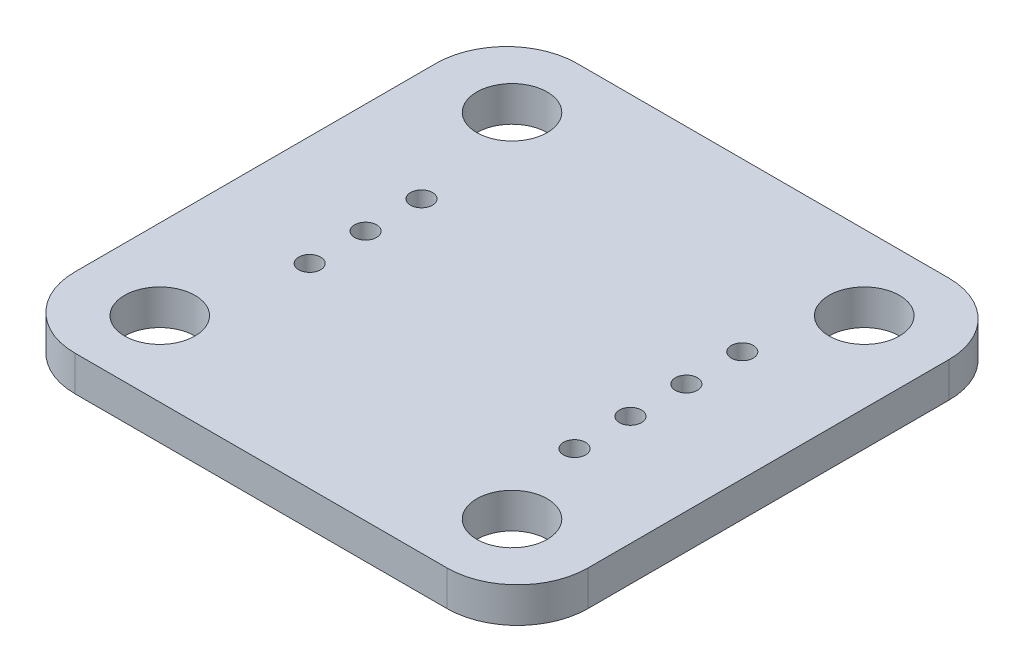
ISO-10303-21;
HEADER;
FILE_DESCRIPTION(('STEP AP214'),'2;1');
FILE_NAME('part.step','',(''),(''),'','','');
FILE_SCHEMA(('AUTOMOTIVE_DESIGN { 1 0 10303 214 1 1 1 1 }'));
ENDSEC;
DATA;
#1=APPLICATION_CONTEXT('core data for automotive mechanical design processes');
#2=APPLICATION_PROTOCOL_DEFINITION('international standard','automotive_design',2000,#1);
#3=PRODUCT_CONTEXT('',#1,'mechanical');
#4=PRODUCT('Part','Part','',(#3));
#5=PRODUCT_RELATED_PRODUCT_CATEGORY('part','',(#4));
#6=PRODUCT_DEFINITION_FORMATION('','',#4);
#7=PRODUCT_DEFINITION_CONTEXT('part definition',#1,'design');
#8=PRODUCT_DEFINITION('design','',#6,#7);
#9=PRODUCT_DEFINITION_SHAPE('','',#8);
#10=(LENGTH_UNIT() NAMED_UNIT(*) SI_UNIT(.MILLI.,.METRE.));
#11=(NAMED_UNIT(*) PLANE_ANGLE_UNIT() SI_UNIT($,.RADIAN.));
#12=(NAMED_UNIT(*) SI_UNIT($,.STERADIAN.) SOLID_ANGLE_UNIT());
#13=UNCERTAINTY_MEASURE_WITH_UNIT(LENGTH_MEASURE(1.E-05),#10,'distance_accuracy_value','');
#14=(GEOMETRIC_REPRESENTATION_CONTEXT(3) GLOBAL_UNCERTAINTY_ASSIGNED_CONTEXT((#13)) GLOBAL_UNIT_ASSIGNED_CONTEXT((#10,
#11,#12)) REPRESENTATION_CONTEXT('',''));
#15=CARTESIAN_POINT('',(0.,0.,0.));
#16=DIRECTION('',(0.,0.,1.));
#17=DIRECTION('',(1.,0.,0.));
#18=AXIS2_PLACEMENT_3D('',#15,#16,#17);
#19=CARTESIAN_POINT('',(-8.45,1.6,8.2));
#20=DIRECTION('',(0.,1.,0.));
#21=DIRECTION('',(0.,0.,1.));
#22=AXIS2_PLACEMENT_3D('',#19,#20,#21);
#23=PLANE('',#22);
#24=CARTESIAN_POINT('',(6.65,1.6,1.27));
#25=DIRECTION('',(0.,1.,0.));
#26=DIRECTION('',(0.,0.,1.));
#27=AXIS2_PLACEMENT_3D('',#24,#25,#26);
#28=CIRCLE('',#27,0.5);
#29=CARTESIAN_POINT('',(6.65,1.6,1.77));
#30=VERTEX_POINT('',#29);
#31=EDGE_CURVE('E231',#30,#30,#28,.T.);
#32=ORIENTED_EDGE('',*,*,#31,.F.);
#33=EDGE_LOOP('',(#32));
#34=FACE_BOUND('',#33,.T.);
#35=CARTESIAN_POINT('',(6.65,1.6,-3.81));
#36=DIRECTION('',(0.,1.,0.));
#37=DIRECTION('',(0.,0.,1.));
#38=AXIS2_PLACEMENT_3D('',#35,#36,#37);
#39=CIRCLE('',#38,0.500000000000001);
#40=CARTESIAN_POINT('',(6.65,1.6,-3.31));
#41=VERTEX_POINT('',#40);
#42=EDGE_CURVE('E219',#41,#41,#39,.T.);
#43=ORIENTED_EDGE('',*,*,#42,.F.);
#44=EDGE_LOOP('',(#43));
#45=FACE_BOUND('',#44,.T.);
#46=CARTESIAN_POINT('',(-6.65,1.6,2.54));
#47=DIRECTION('',(0.,1.,0.));
#48=DIRECTION('',(0.,0.,1.));
#49=AXIS2_PLACEMENT_3D('',#46,#47,#48);
#50=CIRCLE('',#49,0.5);
#51=CARTESIAN_POINT('',(-6.65,1.6,3.04));
#52=VERTEX_POINT('',#51);
#53=EDGE_CURVE('E207',#52,#52,#50,.T.);
#54=ORIENTED_EDGE('',*,*,#53,.F.);
#55=EDGE_LOOP('',(#54));
#56=FACE_BOUND('',#55,.T.);
#57=CARTESIAN_POINT('',(-8.,1.6,8.));
#58=DIRECTION('',(0.,1.,0.));
#59=DIRECTION('',(0.,0.,1.));
#60=AXIS2_PLACEMENT_3D('',#57,#58,#59);
#61=CIRCLE('',#60,1.6);
#62=CARTESIAN_POINT('',(-8.,1.6,9.6));
#63=VERTEX_POINT('',#62);
#64=EDGE_CURVE('E195',#63,#63,#61,.T.);
#65=ORIENTED_EDGE('',*,*,#64,.F.);
#66=EDGE_LOOP('',(#65));
#67=FACE_BOUND('',#66,.T.);
#68=CARTESIAN_POINT('',(8.,1.6,-8.));
#69=DIRECTION('',(0.,1.,0.));
#70=DIRECTION('',(0.,0.,1.));
#71=AXIS2_PLACEMENT_3D('',#68,#69,#70);
#72=CIRCLE('',#71,1.6);
#73=CARTESIAN_POINT('',(8.,1.6,-6.4));
#74=VERTEX_POINT('',#73);
#75=EDGE_CURVE('E183',#74,#74,#72,.T.);
#76=ORIENTED_EDGE('',*,*,#75,.F.);
#77=EDGE_LOOP('',(#76));
#78=FACE_BOUND('',#77,.T.);
#79=CARTESIAN_POINT('',(-8.45,1.6,8.2));
#80=DIRECTION('',(0.,1.,0.));
#81=DIRECTION('',(0.,0.,1.));
#82=AXIS2_PLACEMENT_3D('',#79,#80,#81);
#83=CIRCLE('',#82,3.2);
#84=CARTESIAN_POINT('',(-11.65,1.6,8.19999999999998));
#85=VERTEX_POINT('',#84);
#86=CARTESIAN_POINT('',(-8.44999999999998,1.6,11.4));
#87=VERTEX_POINT('',#86);
#88=EDGE_CURVE('E146',#85,#87,#83,.T.);
#89=ORIENTED_EDGE('',*,*,#88,.T.);
#90=DIRECTION('',(1.,0.,0.));
#91=VECTOR('',#90,1.);
#92=CARTESIAN_POINT('',(-8.44999999999998,1.6,11.4));
#93=LINE('',#92,#91);
#94=CARTESIAN_POINT('',(8.44999999999998,1.6,11.4));
#95=VERTEX_POINT('',#94);
#96=EDGE_CURVE('E94',#87,#95,#93,.T.);
#97=ORIENTED_EDGE('',*,*,#96,.T.);
#98=CARTESIAN_POINT('',(8.45,1.6,8.2));
#99=DIRECTION('',(0.,1.,0.));
#100=DIRECTION('',(0.,0.,1.));
#101=AXIS2_PLACEMENT_3D('',#98,#99,#100);
#102=CIRCLE('',#101,3.2);
#103=CARTESIAN_POINT('',(11.65,1.6,8.19999999999998));
#104=VERTEX_POINT('',#103);
#105=EDGE_CURVE('E161',#95,#104,#102,.T.);
#106=ORIENTED_EDGE('',*,*,#105,.T.);
#107=DIRECTION('',(0.,0.,-1.));
#108=VECTOR('',#107,1.);
#109=CARTESIAN_POINT('',(11.65,1.6,-8.19999999999998));
#110=LINE('',#109,#108);
#111=CARTESIAN_POINT('',(11.65,1.6,-8.19999999999998));
#112=VERTEX_POINT('',#111);
#113=EDGE_CURVE('E174',#104,#112,#110,.T.);
#114=ORIENTED_EDGE('',*,*,#113,.T.);
#115=CARTESIAN_POINT('',(8.45,1.6,-8.2));
#116=DIRECTION('',(0.,1.,0.));
#117=DIRECTION('',(0.,0.,1.));
#118=AXIS2_PLACEMENT_3D('',#115,#116,#117);
#119=CIRCLE('',#118,3.2);
#120=CARTESIAN_POINT('',(8.44999999999997,1.6,-11.4));
#121=VERTEX_POINT('',#120);
#122=EDGE_CURVE('E113',#112,#121,#119,.T.);
#123=ORIENTED_EDGE('',*,*,#122,.T.);
#124=DIRECTION('',(-1.,0.,0.));
#125=VECTOR('',#124,1.);
#126=CARTESIAN_POINT('',(-8.44999999999998,1.6,-11.4));
#127=LINE('',#126,#125);
#128=CARTESIAN_POINT('',(-8.44999999999998,1.6,-11.4));
#129=VERTEX_POINT('',#128);
#130=EDGE_CURVE('E107',#121,#129,#127,.T.);
#131=ORIENTED_EDGE('',*,*,#130,.T.);
#132=CARTESIAN_POINT('',(-8.45,1.6,-8.2));
#133=DIRECTION('',(0.,1.,0.));
#134=DIRECTION('',(0.,0.,1.));
#135=AXIS2_PLACEMENT_3D('',#132,#133,#134);
#136=CIRCLE('',#135,3.2);
#137=CARTESIAN_POINT('',(-11.65,1.6,-8.19999999999998));
#138=VERTEX_POINT('',#137);
#139=EDGE_CURVE('E111',#129,#138,#136,.T.);
#140=ORIENTED_EDGE('',*,*,#139,.T.);
#141=DIRECTION('',(0.,0.,1.));
#142=VECTOR('',#141,1.);
#143=CARTESIAN_POINT('',(-11.65,1.6,-8.19999999999998));
#144=LINE('',#143,#142);
#145=EDGE_CURVE('E51',#138,#85,#144,.T.);
#146=ORIENTED_EDGE('',*,*,#145,.T.);
#147=EDGE_LOOP('',(#89,#97,#106,#114,#123,#131,#140,#146));
#148=FACE_BOUND('',#147,.T.);
#149=CARTESIAN_POINT('',(-8.,1.6,-8.));
#150=DIRECTION('',(0.,1.,0.));
#151=DIRECTION('',(0.,0.,1.));
#152=AXIS2_PLACEMENT_3D('',#149,#150,#151);
#153=CIRCLE('',#152,1.6);
#154=CARTESIAN_POINT('',(-8.,1.6,-6.4));
#155=VERTEX_POINT('',#154);
#156=EDGE_CURVE('E135',#155,#155,#153,.T.);
#157=ORIENTED_EDGE('',*,*,#156,.F.);
#158=EDGE_LOOP('',(#157));
#159=FACE_BOUND('',#158,.T.);
#160=CARTESIAN_POINT('',(8.00000000000001,1.6,8.));
#161=DIRECTION('',(0.,1.,0.));
#162=DIRECTION('',(0.,0.,1.));
#163=AXIS2_PLACEMENT_3D('',#160,#161,#162);
#164=CIRCLE('',#163,1.6);
#165=CARTESIAN_POINT('',(8.00000000000001,1.6,9.6));
#166=VERTEX_POINT('',#165);
#167=EDGE_CURVE('E189',#166,#166,#164,.T.);
#168=ORIENTED_EDGE('',*,*,#167,.F.);
#169=EDGE_LOOP('',(#168));
#170=FACE_BOUND('',#169,.T.);
#171=CARTESIAN_POINT('',(-6.6500000000038,1.6,0.));
#172=DIRECTION('',(0.,1.,0.));
#173=DIRECTION('',(0.,0.,1.));
#174=AXIS2_PLACEMENT_3D('',#171,#172,#173);
#175=CIRCLE('',#174,0.500000000000001);
#176=CARTESIAN_POINT('',(-6.6500000000038,1.6,0.500000000000001));
#177=VERTEX_POINT('',#176);
#178=EDGE_CURVE('E201',#177,#177,#175,.T.);
#179=ORIENTED_EDGE('',*,*,#178,.F.);
#180=EDGE_LOOP('',(#179));
#181=FACE_BOUND('',#180,.T.);
#182=CARTESIAN_POINT('',(-6.65,1.6,-2.54));
#183=DIRECTION('',(0.,1.,0.));
#184=DIRECTION('',(0.,0.,1.));
#185=AXIS2_PLACEMENT_3D('',#182,#183,#184);
#186=CIRCLE('',#185,0.500000000000001);
#187=CARTESIAN_POINT('',(-6.65,1.6,-2.04));
#188=VERTEX_POINT('',#187);
#189=EDGE_CURVE('E213',#188,#188,#186,.T.);
#190=ORIENTED_EDGE('',*,*,#189,.F.);
#191=EDGE_LOOP('',(#190));
#192=FACE_BOUND('',#191,.T.);
#193=CARTESIAN_POINT('',(6.65000000000004,1.6,-1.27));
#194=DIRECTION('',(0.,1.,0.));
#195=DIRECTION('',(0.,0.,1.));
#196=AXIS2_PLACEMENT_3D('',#193,#194,#195);
#197=CIRCLE('',#196,0.5);
#198=CARTESIAN_POINT('',(6.65000000000004,1.6,-0.77));
#199=VERTEX_POINT('',#198);
#200=EDGE_CURVE('E225',#199,#199,#197,.T.);
#201=ORIENTED_EDGE('',*,*,#200,.F.);
#202=EDGE_LOOP('',(#201));
#203=FACE_BOUND('',#202,.T.);
#204=CARTESIAN_POINT('',(6.65,1.6,3.81));
#205=DIRECTION('',(0.,1.,0.));
#206=DIRECTION('',(0.,0.,1.));
#207=AXIS2_PLACEMENT_3D('',#204,#205,#206);
#208=CIRCLE('',#207,0.5);
#209=CARTESIAN_POINT('',(6.65,1.6,4.31));
#210=VERTEX_POINT('',#209);
#211=EDGE_CURVE('E237',#210,#210,#208,.T.);
#212=ORIENTED_EDGE('',*,*,#211,.F.);
#213=EDGE_LOOP('',(#212));
#214=FACE_BOUND('',#213,.T.);
#215=ADVANCED_FACE('F34',(#34,#45,#56,#67,#78,#148,#159,#170,#181,#192,#203,#214),#23,.T.);
#216=CARTESIAN_POINT('',(-8.45,0.,8.2));
#217=DIRECTION('',(0.,1.,0.));
#218=DIRECTION('',(0.,0.,1.));
#219=AXIS2_PLACEMENT_3D('',#216,#217,#218);
#220=PLANE('',#219);
#221=CARTESIAN_POINT('',(-8.45,0.,8.2));
#222=DIRECTION('',(0.,1.,0.));
#223=DIRECTION('',(0.,0.,1.));
#224=AXIS2_PLACEMENT_3D('',#221,#222,#223);
#225=CIRCLE('',#224,3.2);
#226=CARTESIAN_POINT('',(-11.65,0.,8.19999999999998));
#227=VERTEX_POINT('',#226);
#228=CARTESIAN_POINT('',(-8.44999999999998,0.,11.4));
#229=VERTEX_POINT('',#228);
#230=EDGE_CURVE('E131',#227,#229,#225,.T.);
#231=ORIENTED_EDGE('',*,*,#230,.F.);
#232=DIRECTION('',(0.,0.,1.));
#233=VECTOR('',#232,1.);
#234=CARTESIAN_POINT('',(-11.65,0.,-8.19999999999998));
#235=LINE('',#234,#233);
#236=CARTESIAN_POINT('',(-11.65,0.,-8.19999999999998));
#237=VERTEX_POINT('',#236);
#238=EDGE_CURVE('E86',#237,#227,#235,.T.);
#239=ORIENTED_EDGE('',*,*,#238,.F.);
#240=CARTESIAN_POINT('',(-8.45,0.,-8.2));
#241=DIRECTION('',(0.,1.,0.));
#242=DIRECTION('',(0.,0.,1.));
#243=AXIS2_PLACEMENT_3D('',#240,#241,#242);
#244=CIRCLE('',#243,3.2);
#245=CARTESIAN_POINT('',(-8.44999999999998,0.,-11.4));
#246=VERTEX_POINT('',#245);
#247=EDGE_CURVE('E80',#246,#237,#244,.T.);
#248=ORIENTED_EDGE('',*,*,#247,.F.);
#249=DIRECTION('',(-1.,0.,0.));
#250=VECTOR('',#249,1.);
#251=CARTESIAN_POINT('',(-8.44999999999998,0.,-11.4));
#252=LINE('',#251,#250);
#253=CARTESIAN_POINT('',(8.44999999999997,0.,-11.4));
#254=VERTEX_POINT('',#253);
#255=EDGE_CURVE('E121',#254,#246,#252,.T.);
#256=ORIENTED_EDGE('',*,*,#255,.F.);
#257=CARTESIAN_POINT('',(8.45,0.,-8.2));
#258=DIRECTION('',(0.,1.,0.));
#259=DIRECTION('',(0.,0.,1.));
#260=AXIS2_PLACEMENT_3D('',#257,#258,#259);
#261=CIRCLE('',#260,3.2);
#262=CARTESIAN_POINT('',(11.65,0.,-8.19999999999998));
#263=VERTEX_POINT('',#262);
#264=EDGE_CURVE('E141',#263,#254,#261,.T.);
#265=ORIENTED_EDGE('',*,*,#264,.F.);
#266=DIRECTION('',(0.,0.,-1.));
#267=VECTOR('',#266,1.);
#268=CARTESIAN_POINT('',(11.65,0.,-8.19999999999998));
#269=LINE('',#268,#267);
#270=CARTESIAN_POINT('',(11.65,0.,8.19999999999998));
#271=VERTEX_POINT('',#270);
#272=EDGE_CURVE('E139',#271,#263,#269,.T.);
#273=ORIENTED_EDGE('',*,*,#272,.F.);
#274=CARTESIAN_POINT('',(8.45,0.,8.2));
#275=DIRECTION('',(0.,1.,0.));
#276=DIRECTION('',(0.,0.,1.));
#277=AXIS2_PLACEMENT_3D('',#274,#275,#276);
#278=CIRCLE('',#277,3.2);
#279=CARTESIAN_POINT('',(8.44999999999998,0.,11.4));
#280=VERTEX_POINT('',#279);
#281=EDGE_CURVE('E137',#280,#271,#278,.T.);
#282=ORIENTED_EDGE('',*,*,#281,.F.);
#283=DIRECTION('',(1.,0.,0.));
#284=VECTOR('',#283,1.);
#285=CARTESIAN_POINT('',(-8.44999999999998,0.,11.4));
#286=LINE('',#285,#284);
#287=EDGE_CURVE('E134',#229,#280,#286,.T.);
#288=ORIENTED_EDGE('',*,*,#287,.F.);
#289=EDGE_LOOP('',(#231,#239,#248,#256,#265,#273,#282,#288));
#290=FACE_BOUND('',#289,.T.);
#291=CARTESIAN_POINT('',(-8.,0.,-8.));
#292=DIRECTION('',(0.,1.,0.));
#293=DIRECTION('',(0.,0.,1.));
#294=AXIS2_PLACEMENT_3D('',#291,#292,#293);
#295=CIRCLE('',#294,1.6);
#296=CARTESIAN_POINT('',(-8.,0.,-6.4));
#297=VERTEX_POINT('',#296);
#298=EDGE_CURVE('E180',#297,#297,#295,.T.);
#299=ORIENTED_EDGE('',*,*,#298,.T.);
#300=EDGE_LOOP('',(#299));
#301=FACE_BOUND('',#300,.T.);
#302=CARTESIAN_POINT('',(8.,0.,-8.));
#303=DIRECTION('',(0.,1.,0.));
#304=DIRECTION('',(0.,0.,1.));
#305=AXIS2_PLACEMENT_3D('',#302,#303,#304);
#306=CIRCLE('',#305,1.6);
#307=CARTESIAN_POINT('',(8.,0.,-6.4));
#308=VERTEX_POINT('',#307);
#309=EDGE_CURVE('E186',#308,#308,#306,.T.);
#310=ORIENTED_EDGE('',*,*,#309,.T.);
#311=EDGE_LOOP('',(#310));
#312=FACE_BOUND('',#311,.T.);
#313=CARTESIAN_POINT('',(8.00000000000001,0.,8.));
#314=DIRECTION('',(0.,1.,0.));
#315=DIRECTION('',(0.,0.,1.));
#316=AXIS2_PLACEMENT_3D('',#313,#314,#315);
#317=CIRCLE('',#316,1.6);
#318=CARTESIAN_POINT('',(8.00000000000001,0.,9.6));
#319=VERTEX_POINT('',#318);
#320=EDGE_CURVE('E192',#319,#319,#317,.T.);
#321=ORIENTED_EDGE('',*,*,#320,.T.);
#322=EDGE_LOOP('',(#321));
#323=FACE_BOUND('',#322,.T.);
#324=CARTESIAN_POINT('',(-8.,0.,8.));
#325=DIRECTION('',(0.,1.,0.));
#326=DIRECTION('',(0.,0.,1.));
#327=AXIS2_PLACEMENT_3D('',#324,#325,#326);
#328=CIRCLE('',#327,1.6);
#329=CARTESIAN_POINT('',(-8.,0.,9.6));
#330=VERTEX_POINT('',#329);
#331=EDGE_CURVE('E198',#330,#330,#328,.T.);
#332=ORIENTED_EDGE('',*,*,#331,.T.);
#333=EDGE_LOOP('',(#332));
#334=FACE_BOUND('',#333,.T.);
#335=CARTESIAN_POINT('',(-6.6500000000038,0.,0.));
#336=DIRECTION('',(0.,1.,0.));
#337=DIRECTION('',(0.,0.,1.));
#338=AXIS2_PLACEMENT_3D('',#335,#336,#337);
#339=CIRCLE('',#338,0.500000000000001);
#340=CARTESIAN_POINT('',(-6.6500000000038,0.,0.500000000000001));
#341=VERTEX_POINT('',#340);
#342=EDGE_CURVE('E204',#341,#341,#339,.T.);
#343=ORIENTED_EDGE('',*,*,#342,.T.);
#344=EDGE_LOOP('',(#343));
#345=FACE_BOUND('',#344,.T.);
#346=CARTESIAN_POINT('',(-6.65,0.,2.54));
#347=DIRECTION('',(0.,1.,0.));
#348=DIRECTION('',(0.,0.,1.));
#349=AXIS2_PLACEMENT_3D('',#346,#347,#348);
#350=CIRCLE('',#349,0.5);
#351=CARTESIAN_POINT('',(-6.65,0.,3.04));
#352=VERTEX_POINT('',#351);
#353=EDGE_CURVE('E210',#352,#352,#350,.T.);
#354=ORIENTED_EDGE('',*,*,#353,.T.);
#355=EDGE_LOOP('',(#354));
#356=FACE_BOUND('',#355,.T.);
#357=CARTESIAN_POINT('',(-6.65,0.,-2.54));
#358=DIRECTION('',(0.,1.,0.));
#359=DIRECTION('',(0.,0.,1.));
#360=AXIS2_PLACEMENT_3D('',#357,#358,#359);
#361=CIRCLE('',#360,0.500000000000001);
#362=CARTESIAN_POINT('',(-6.65,0.,-2.04));
#363=VERTEX_POINT('',#362);
#364=EDGE_CURVE('E216',#363,#363,#361,.T.);
#365=ORIENTED_EDGE('',*,*,#364,.T.);
#366=EDGE_LOOP('',(#365));
#367=FACE_BOUND('',#366,.T.);
#368=CARTESIAN_POINT('',(6.65,0.,-3.81));
#369=DIRECTION('',(0.,1.,0.));
#370=DIRECTION('',(0.,0.,1.));
#371=AXIS2_PLACEMENT_3D('',#368,#369,#370);
#372=CIRCLE('',#371,0.500000000000001);
#373=CARTESIAN_POINT('',(6.65,0.,-3.31));
#374=VERTEX_POINT('',#373);
#375=EDGE_CURVE('E222',#374,#374,#372,.T.);
#376=ORIENTED_EDGE('',*,*,#375,.T.);
#377=EDGE_LOOP('',(#376));
#378=FACE_BOUND('',#377,.T.);
#379=CARTESIAN_POINT('',(6.65000000000004,0.,-1.27));
#380=DIRECTION('',(0.,1.,0.));
#381=DIRECTION('',(0.,0.,1.));
#382=AXIS2_PLACEMENT_3D('',#379,#380,#381);
#383=CIRCLE('',#382,0.5);
#384=CARTESIAN_POINT('',(6.65000000000004,0.,-0.77));
#385=VERTEX_POINT('',#384);
#386=EDGE_CURVE('E228',#385,#385,#383,.T.);
#387=ORIENTED_EDGE('',*,*,#386,.T.);
#388=EDGE_LOOP('',(#387));
#389=FACE_BOUND('',#388,.T.);
#390=CARTESIAN_POINT('',(6.65,0.,1.27));
#391=DIRECTION('',(0.,1.,0.));
#392=DIRECTION('',(0.,0.,1.));
#393=AXIS2_PLACEMENT_3D('',#390,#391,#392);
#394=CIRCLE('',#393,0.5);
#395=CARTESIAN_POINT('',(6.65,0.,1.77));
#396=VERTEX_POINT('',#395);
#397=EDGE_CURVE('E234',#396,#396,#394,.T.);
#398=ORIENTED_EDGE('',*,*,#397,.T.);
#399=EDGE_LOOP('',(#398));
#400=FACE_BOUND('',#399,.T.);
#401=CARTESIAN_POINT('',(6.65,0.,3.81));
#402=DIRECTION('',(0.,1.,0.));
#403=DIRECTION('',(0.,0.,1.));
#404=AXIS2_PLACEMENT_3D('',#401,#402,#403);
#405=CIRCLE('',#404,0.5);
#406=CARTESIAN_POINT('',(6.65,0.,4.31));
#407=VERTEX_POINT('',#406);
#408=EDGE_CURVE('E240',#407,#407,#405,.T.);
#409=ORIENTED_EDGE('',*,*,#408,.T.);
#410=EDGE_LOOP('',(#409));
#411=FACE_BOUND('',#410,.T.);
#412=ADVANCED_FACE('F165',(#290,#301,#312,#323,#334,#345,#356,#367,#378,#389,#400,#411),#220,.F.);
#413=CARTESIAN_POINT('',(-8.45,1.6,8.2));
#414=DIRECTION('',(0.,-1.,0.));
#415=DIRECTION('',(0.,0.,-1.));
#416=AXIS2_PLACEMENT_3D('',#413,#414,#415);
#417=CYLINDRICAL_SURFACE('',#416,3.2);
#418=ORIENTED_EDGE('',*,*,#230,.T.);
#419=DIRECTION('',(0.,-1.,0.));
#420=VECTOR('',#419,1.);
#421=CARTESIAN_POINT('',(-8.44999999999998,1.6,11.4));
#422=LINE('',#421,#420);
#423=EDGE_CURVE('E11',#87,#229,#422,.T.);
#424=ORIENTED_EDGE('',*,*,#423,.F.);
#425=ORIENTED_EDGE('',*,*,#88,.F.);
#426=DIRECTION('',(0.,-1.,0.));
#427=VECTOR('',#426,1.);
#428=CARTESIAN_POINT('',(-11.65,1.6,8.19999999999998));
#429=LINE('',#428,#427);
#430=EDGE_CURVE('E127',#85,#227,#429,.T.);
#431=ORIENTED_EDGE('',*,*,#430,.T.);
#432=EDGE_LOOP('',(#418,#424,#425,#431));
#433=FACE_BOUND('',#432,.T.);
#434=ADVANCED_FACE('F36',(#433),#417,.T.);
#435=CARTESIAN_POINT('',(-8.44999999999998,1.6,11.4));
#436=DIRECTION('',(0.,0.,-1.));
#437=DIRECTION('',(-1.,0.,0.));
#438=AXIS2_PLACEMENT_3D('',#435,#436,#437);
#439=PLANE('',#438);
#440=ORIENTED_EDGE('',*,*,#287,.T.);
#441=DIRECTION('',(0.,-1.,0.));
#442=VECTOR('',#441,1.);
#443=CARTESIAN_POINT('',(8.44999999999998,1.6,11.4));
#444=LINE('',#443,#442);
#445=EDGE_CURVE('E43',#95,#280,#444,.T.);
#446=ORIENTED_EDGE('',*,*,#445,.F.);
#447=ORIENTED_EDGE('',*,*,#96,.F.);
#448=ORIENTED_EDGE('',*,*,#423,.T.);
#449=EDGE_LOOP('',(#440,#446,#447,#448));
#450=FACE_BOUND('',#449,.T.);
#451=ADVANCED_FACE('F274',(#450),#439,.F.);
#452=CARTESIAN_POINT('',(8.45,1.6,8.2));
#453=DIRECTION('',(0.,-1.,0.));
#454=DIRECTION('',(0.,0.,-1.));
#455=AXIS2_PLACEMENT_3D('',#452,#453,#454);
#456=CYLINDRICAL_SURFACE('',#455,3.2);
#457=ORIENTED_EDGE('',*,*,#281,.T.);
#458=DIRECTION('',(0.,-1.,0.));
#459=VECTOR('',#458,1.);
#460=CARTESIAN_POINT('',(11.65,1.6,8.19999999999998));
#461=LINE('',#460,#459);
#462=EDGE_CURVE('E153',#104,#271,#461,.T.);
#463=ORIENTED_EDGE('',*,*,#462,.F.);
#464=ORIENTED_EDGE('',*,*,#105,.F.);
#465=ORIENTED_EDGE('',*,*,#445,.T.);
#466=EDGE_LOOP('',(#457,#463,#464,#465));
#467=FACE_BOUND('',#466,.T.);
#468=ADVANCED_FACE('F159',(#467),#456,.T.);
#469=CARTESIAN_POINT('',(11.65,1.6,-8.19999999999998));
#470=DIRECTION('',(-1.,0.,0.));
#471=DIRECTION('',(0.,0.,1.));
#472=AXIS2_PLACEMENT_3D('',#469,#470,#471);
#473=PLANE('',#472);
#474=ORIENTED_EDGE('',*,*,#272,.T.);
#475=DIRECTION('',(0.,-1.,0.));
#476=VECTOR('',#475,1.);
#477=CARTESIAN_POINT('',(11.65,1.6,-8.19999999999998));
#478=LINE('',#477,#476);
#479=EDGE_CURVE('E150',#112,#263,#478,.T.);
#480=ORIENTED_EDGE('',*,*,#479,.F.);
#481=ORIENTED_EDGE('',*,*,#113,.F.);
#482=ORIENTED_EDGE('',*,*,#462,.T.);
#483=EDGE_LOOP('',(#474,#480,#481,#482));
#484=FACE_BOUND('',#483,.T.);
#485=ADVANCED_FACE('F170',(#484),#473,.F.);
#486=CARTESIAN_POINT('',(8.45,1.6,-8.2));
#487=DIRECTION('',(0.,-1.,0.));
#488=DIRECTION('',(0.,0.,-1.));
#489=AXIS2_PLACEMENT_3D('',#486,#487,#488);
#490=CYLINDRICAL_SURFACE('',#489,3.2);
#491=ORIENTED_EDGE('',*,*,#264,.T.);
#492=DIRECTION('',(0.,-1.,0.));
#493=VECTOR('',#492,1.);
#494=CARTESIAN_POINT('',(8.44999999999997,1.6,-11.4));
#495=LINE('',#494,#493);
#496=EDGE_CURVE('E122',#121,#254,#495,.T.);
#497=ORIENTED_EDGE('',*,*,#496,.F.);
#498=ORIENTED_EDGE('',*,*,#122,.F.);
#499=ORIENTED_EDGE('',*,*,#479,.T.);
#500=EDGE_LOOP('',(#491,#497,#498,#499));
#501=FACE_BOUND('',#500,.T.);
#502=ADVANCED_FACE('F173',(#501),#490,.T.);
#503=CARTESIAN_POINT('',(-8.44999999999998,1.6,-11.4));
#504=DIRECTION('',(0.,0.,1.));
#505=DIRECTION('',(1.,0.,0.));
#506=AXIS2_PLACEMENT_3D('',#503,#504,#505);
#507=PLANE('',#506);
#508=ORIENTED_EDGE('',*,*,#255,.T.);
#509=DIRECTION('',(0.,-1.,0.));
#510=VECTOR('',#509,1.);
#511=CARTESIAN_POINT('',(-8.44999999999998,1.6,-11.4));
#512=LINE('',#511,#510);
#513=EDGE_CURVE('E118',#129,#246,#512,.T.);
#514=ORIENTED_EDGE('',*,*,#513,.F.);
#515=ORIENTED_EDGE('',*,*,#130,.F.);
#516=ORIENTED_EDGE('',*,*,#496,.T.);
#517=EDGE_LOOP('',(#508,#514,#515,#516));
#518=FACE_BOUND('',#517,.T.);
#519=ADVANCED_FACE('F119',(#518),#507,.F.);
#520=CARTESIAN_POINT('',(-8.45,1.6,-8.2));
#521=DIRECTION('',(0.,-1.,0.));
#522=DIRECTION('',(0.,0.,-1.));
#523=AXIS2_PLACEMENT_3D('',#520,#521,#522);
#524=CYLINDRICAL_SURFACE('',#523,3.2);
#525=ORIENTED_EDGE('',*,*,#247,.T.);
#526=DIRECTION('',(0.,-1.,0.));
#527=VECTOR('',#526,1.);
#528=CARTESIAN_POINT('',(-11.65,1.6,-8.19999999999998));
#529=LINE('',#528,#527);
#530=EDGE_CURVE('E123',#138,#237,#529,.T.);
#531=ORIENTED_EDGE('',*,*,#530,.F.);
#532=ORIENTED_EDGE('',*,*,#139,.F.);
#533=ORIENTED_EDGE('',*,*,#513,.T.);
#534=EDGE_LOOP('',(#525,#531,#532,#533));
#535=FACE_BOUND('',#534,.T.);
#536=ADVANCED_FACE('F125',(#535),#524,.T.);
#537=CARTESIAN_POINT('',(-11.65,1.6,-8.19999999999998));
#538=DIRECTION('',(1.,0.,0.));
#539=DIRECTION('',(0.,0.,-1.));
#540=AXIS2_PLACEMENT_3D('',#537,#538,#539);
#541=PLANE('',#540);
#542=ORIENTED_EDGE('',*,*,#238,.T.);
#543=ORIENTED_EDGE('',*,*,#430,.F.);
#544=ORIENTED_EDGE('',*,*,#145,.F.);
#545=ORIENTED_EDGE('',*,*,#530,.T.);
#546=EDGE_LOOP('',(#542,#543,#544,#545));
#547=FACE_BOUND('',#546,.T.);
#548=ADVANCED_FACE('F262',(#547),#541,.F.);
#549=CARTESIAN_POINT('',(-8.,1.6,-8.));
#550=DIRECTION('',(0.,-1.,0.));
#551=DIRECTION('',(0.,0.,-1.));
#552=AXIS2_PLACEMENT_3D('',#549,#550,#551);
#553=CYLINDRICAL_SURFACE('',#552,1.6);
#554=ORIENTED_EDGE('',*,*,#156,.T.);
#555=EDGE_LOOP('',(#554));
#556=FACE_BOUND('',#555,.T.);
#557=ORIENTED_EDGE('',*,*,#298,.F.);
#558=EDGE_LOOP('',(#557));
#559=FACE_BOUND('',#558,.T.);
#560=ADVANCED_FACE('F259',(#556,#559),#553,.F.);
#561=CARTESIAN_POINT('',(8.,1.6,-8.));
#562=DIRECTION('',(0.,-1.,0.));
#563=DIRECTION('',(0.,0.,-1.));
#564=AXIS2_PLACEMENT_3D('',#561,#562,#563);
#565=CYLINDRICAL_SURFACE('',#564,1.6);
#566=ORIENTED_EDGE('',*,*,#75,.T.);
#567=EDGE_LOOP('',(#566));
#568=FACE_BOUND('',#567,.T.);
#569=ORIENTED_EDGE('',*,*,#309,.F.);
#570=EDGE_LOOP('',(#569));
#571=FACE_BOUND('',#570,.T.);
#572=ADVANCED_FACE('F348',(#568,#571),#565,.F.);
#573=CARTESIAN_POINT('',(8.00000000000001,1.6,8.));
#574=DIRECTION('',(0.,-1.,0.));
#575=DIRECTION('',(0.,0.,-1.));
#576=AXIS2_PLACEMENT_3D('',#573,#574,#575);
#577=CYLINDRICAL_SURFACE('',#576,1.6);
#578=ORIENTED_EDGE('',*,*,#167,.T.);
#579=EDGE_LOOP('',(#578));
#580=FACE_BOUND('',#579,.T.);
#581=ORIENTED_EDGE('',*,*,#320,.F.);
#582=EDGE_LOOP('',(#581));
#583=FACE_BOUND('',#582,.T.);
#584=ADVANCED_FACE('F356',(#580,#583),#577,.F.);
#585=CARTESIAN_POINT('',(-8.,1.6,8.));
#586=DIRECTION('',(0.,-1.,0.));
#587=DIRECTION('',(0.,0.,-1.));
#588=AXIS2_PLACEMENT_3D('',#585,#586,#587);
#589=CYLINDRICAL_SURFACE('',#588,1.6);
#590=ORIENTED_EDGE('',*,*,#64,.T.);
#591=EDGE_LOOP('',(#590));
#592=FACE_BOUND('',#591,.T.);
#593=ORIENTED_EDGE('',*,*,#331,.F.);
#594=EDGE_LOOP('',(#593));
#595=FACE_BOUND('',#594,.T.);
#596=ADVANCED_FACE('F364',(#592,#595),#589,.F.);
#597=CARTESIAN_POINT('',(-6.6500000000038,1.6,0.));
#598=DIRECTION('',(0.,-1.,0.));
#599=DIRECTION('',(0.,0.,-1.));
#600=AXIS2_PLACEMENT_3D('',#597,#598,#599);
#601=CYLINDRICAL_SURFACE('',#600,0.500000000000001);
#602=ORIENTED_EDGE('',*,*,#178,.T.);
#603=EDGE_LOOP('',(#602));
#604=FACE_BOUND('',#603,.T.);
#605=ORIENTED_EDGE('',*,*,#342,.F.);
#606=EDGE_LOOP('',(#605));
#607=FACE_BOUND('',#606,.T.);
#608=ADVANCED_FACE('F373',(#604,#607),#601,.F.);
#609=CARTESIAN_POINT('',(-6.65,1.6,2.54));
#610=DIRECTION('',(0.,-1.,0.));
#611=DIRECTION('',(0.,0.,-1.));
#612=AXIS2_PLACEMENT_3D('',#609,#610,#611);
#613=CYLINDRICAL_SURFACE('',#612,0.5);
#614=ORIENTED_EDGE('',*,*,#53,.T.);
#615=EDGE_LOOP('',(#614));
#616=FACE_BOUND('',#615,.T.);
#617=ORIENTED_EDGE('',*,*,#353,.F.);
#618=EDGE_LOOP('',(#617));
#619=FACE_BOUND('',#618,.T.);
#620=ADVANCED_FACE('F382',(#616,#619),#613,.F.);
#621=CARTESIAN_POINT('',(-6.65,1.6,-2.54));
#622=DIRECTION('',(0.,-1.,0.));
#623=DIRECTION('',(0.,0.,-1.));
#624=AXIS2_PLACEMENT_3D('',#621,#622,#623);
#625=CYLINDRICAL_SURFACE('',#624,0.500000000000001);
#626=ORIENTED_EDGE('',*,*,#189,.T.);
#627=EDGE_LOOP('',(#626));
#628=FACE_BOUND('',#627,.T.);
#629=ORIENTED_EDGE('',*,*,#364,.F.);
#630=EDGE_LOOP('',(#629));
#631=FACE_BOUND('',#630,.T.);
#632=ADVANCED_FACE('F392',(#628,#631),#625,.F.);
#633=CARTESIAN_POINT('',(6.65,1.6,-3.81));
#634=DIRECTION('',(0.,-1.,0.));
#635=DIRECTION('',(0.,0.,-1.));
#636=AXIS2_PLACEMENT_3D('',#633,#634,#635);
#637=CYLINDRICAL_SURFACE('',#636,0.500000000000001);
#638=ORIENTED_EDGE('',*,*,#42,.T.);
#639=EDGE_LOOP('',(#638));
#640=FACE_BOUND('',#639,.T.);
#641=ORIENTED_EDGE('',*,*,#375,.F.);
#642=EDGE_LOOP('',(#641));
#643=FACE_BOUND('',#642,.T.);
#644=ADVANCED_FACE('F294',(#640,#643),#637,.F.);
#645=CARTESIAN_POINT('',(6.65000000000004,1.6,-1.27));
#646=DIRECTION('',(0.,-1.,0.));
#647=DIRECTION('',(0.,0.,-1.));
#648=AXIS2_PLACEMENT_3D('',#645,#646,#647);
#649=CYLINDRICAL_SURFACE('',#648,0.5);
#650=ORIENTED_EDGE('',*,*,#200,.T.);
#651=EDGE_LOOP('',(#650));
#652=FACE_BOUND('',#651,.T.);
#653=ORIENTED_EDGE('',*,*,#386,.F.);
#654=EDGE_LOOP('',(#653));
#655=FACE_BOUND('',#654,.T.);
#656=ADVANCED_FACE('F409',(#652,#655),#649,.F.);
#657=CARTESIAN_POINT('',(6.65,1.6,1.27));
#658=DIRECTION('',(0.,-1.,0.));
#659=DIRECTION('',(0.,0.,-1.));
#660=AXIS2_PLACEMENT_3D('',#657,#658,#659);
#661=CYLINDRICAL_SURFACE('',#660,0.5);
#662=ORIENTED_EDGE('',*,*,#31,.T.);
#663=EDGE_LOOP('',(#662));
#664=FACE_BOUND('',#663,.T.);
#665=ORIENTED_EDGE('',*,*,#397,.F.);
#666=EDGE_LOOP('',(#665));
#667=FACE_BOUND('',#666,.T.);
#668=ADVANCED_FACE('F418',(#664,#667),#661,.F.);
#669=CARTESIAN_POINT('',(6.65,1.6,3.81));
#670=DIRECTION('',(0.,-1.,0.));
#671=DIRECTION('',(0.,0.,-1.));
#672=AXIS2_PLACEMENT_3D('',#669,#670,#671);
#673=CYLINDRICAL_SURFACE('',#672,0.5);
#674=ORIENTED_EDGE('',*,*,#211,.T.);
#675=EDGE_LOOP('',(#674));
#676=FACE_BOUND('',#675,.T.);
#677=ORIENTED_EDGE('',*,*,#408,.F.);
#678=EDGE_LOOP('',(#677));
#679=FACE_BOUND('',#678,.T.);
#680=ADVANCED_FACE('F246',(#676,#679),#673,.F.);
#681=CLOSED_SHELL('',(#215,#412,#434,#451,#468,#485,#502,#519,#536,#548,#560,#572,#584,#596,
#608,#620,#632,#644,#656,#668,#680));
#682=MANIFOLD_SOLID_BREP('B2',#681);
#683=ADVANCED_BREP_SHAPE_REPRESENTATION('',(#18,#682),#14);
#684=SHAPE_DEFINITION_REPRESENTATION(#9,#683);
ENDSEC;
END-ISO-10303-21;
